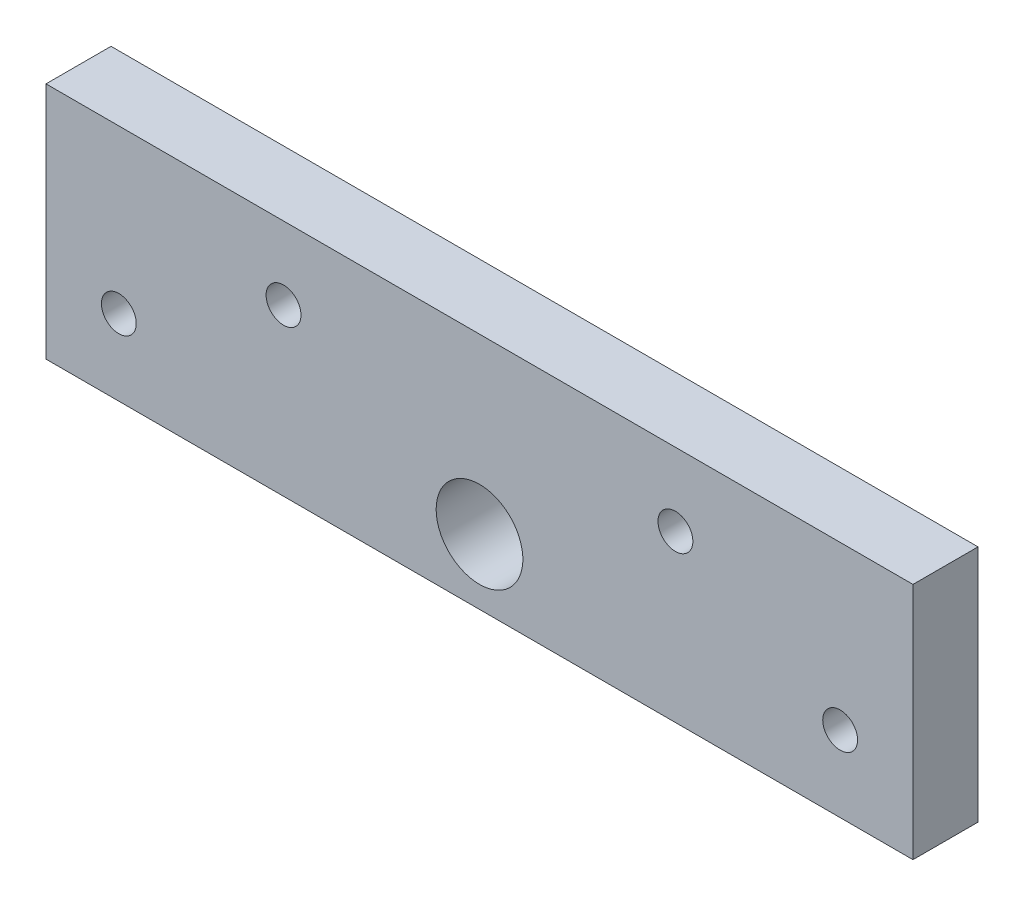
ISO-10303-21;
HEADER;
FILE_DESCRIPTION(('STEP AP214'),'2;1');
FILE_NAME('part.step','',(''),(''),'','','');
FILE_SCHEMA(('AUTOMOTIVE_DESIGN { 1 0 10303 214 1 1 1 1 }'));
ENDSEC;
DATA;
#1=APPLICATION_CONTEXT('core data for automotive mechanical design processes');
#2=APPLICATION_PROTOCOL_DEFINITION('international standard','automotive_design',2000,#1);
#3=PRODUCT_CONTEXT('',#1,'mechanical');
#4=PRODUCT('Part','Part','',(#3));
#5=PRODUCT_RELATED_PRODUCT_CATEGORY('part','',(#4));
#6=PRODUCT_DEFINITION_FORMATION('','',#4);
#7=PRODUCT_DEFINITION_CONTEXT('part definition',#1,'design');
#8=PRODUCT_DEFINITION('design','',#6,#7);
#9=PRODUCT_DEFINITION_SHAPE('','',#8);
#10=(LENGTH_UNIT() NAMED_UNIT(*) SI_UNIT(.MILLI.,.METRE.));
#11=(NAMED_UNIT(*) PLANE_ANGLE_UNIT() SI_UNIT($,.RADIAN.));
#12=(NAMED_UNIT(*) SI_UNIT($,.STERADIAN.) SOLID_ANGLE_UNIT());
#13=UNCERTAINTY_MEASURE_WITH_UNIT(LENGTH_MEASURE(1.E-05),#10,'distance_accuracy_value','');
#14=(GEOMETRIC_REPRESENTATION_CONTEXT(3) GLOBAL_UNCERTAINTY_ASSIGNED_CONTEXT((#13)) GLOBAL_UNIT_ASSIGNED_CONTEXT((#10,
#11,#12)) REPRESENTATION_CONTEXT('',''));
#15=CARTESIAN_POINT('',(0.,0.,0.));
#16=DIRECTION('',(0.,0.,1.));
#17=DIRECTION('',(1.,0.,0.));
#18=AXIS2_PLACEMENT_3D('',#15,#16,#17);
#19=CARTESIAN_POINT('',(0.,0.,0.));
#20=DIRECTION('',(0.,0.,1.));
#21=DIRECTION('',(1.,0.,0.));
#22=AXIS2_PLACEMENT_3D('',#19,#20,#21);
#23=PLANE('',#22);
#24=CARTESIAN_POINT('',(0.,6.34999999999999,0.));
#25=DIRECTION('',(0.,0.,1.));
#26=DIRECTION('',(1.,0.,0.));
#27=AXIS2_PLACEMENT_3D('',#24,#25,#26);
#28=CIRCLE('',#27,6.35);
#29=CARTESIAN_POINT('',(-6.35000000000002,6.34999999999999,0.));
#30=VERTEX_POINT('',#29);
#31=EDGE_CURVE('E114',#30,#30,#28,.T.);
#32=ORIENTED_EDGE('',*,*,#31,.T.);
#33=EDGE_LOOP('',(#32));
#34=FACE_BOUND('',#33,.T.);
#35=DIRECTION('',(0.,-1.,0.));
#36=VECTOR('',#35,1.);
#37=CARTESIAN_POINT('',(-63.5,31.75,0.));
#38=LINE('',#37,#36);
#39=CARTESIAN_POINT('',(-63.5,31.75,0.));
#40=VERTEX_POINT('',#39);
#41=CARTESIAN_POINT('',(-63.5,-3.17500000000001,0.));
#42=VERTEX_POINT('',#41);
#43=EDGE_CURVE('E100',#40,#42,#38,.T.);
#44=ORIENTED_EDGE('',*,*,#43,.F.);
#45=DIRECTION('',(-1.,0.,0.));
#46=VECTOR('',#45,1.);
#47=CARTESIAN_POINT('',(-63.5,31.75,0.));
#48=LINE('',#47,#46);
#49=CARTESIAN_POINT('',(63.5,31.75,0.));
#50=VERTEX_POINT('',#49);
#51=EDGE_CURVE('E75',#50,#40,#48,.T.);
#52=ORIENTED_EDGE('',*,*,#51,.F.);
#53=DIRECTION('',(0.,1.,0.));
#54=VECTOR('',#53,1.);
#55=CARTESIAN_POINT('',(63.5,31.75,0.));
#56=LINE('',#55,#54);
#57=CARTESIAN_POINT('',(63.5,-3.17500000000001,0.));
#58=VERTEX_POINT('',#57);
#59=EDGE_CURVE('E69',#58,#50,#56,.T.);
#60=ORIENTED_EDGE('',*,*,#59,.F.);
#61=DIRECTION('',(1.,0.,0.));
#62=VECTOR('',#61,1.);
#63=CARTESIAN_POINT('',(-63.5,-3.17500000000001,0.));
#64=LINE('',#63,#62);
#65=EDGE_CURVE('E92',#42,#58,#64,.T.);
#66=ORIENTED_EDGE('',*,*,#65,.F.);
#67=EDGE_LOOP('',(#44,#52,#60,#66));
#68=FACE_BOUND('',#67,.T.);
#69=CARTESIAN_POINT('',(-52.832,7.93749999999999,0.));
#70=DIRECTION('',(0.,0.,-1.));
#71=DIRECTION('',(-1.,0.,0.));
#72=AXIS2_PLACEMENT_3D('',#69,#70,#71);
#73=CIRCLE('',#72,5.3975);
#74=CARTESIAN_POINT('',(-58.2295,7.93749999999999,0.));
#75=VERTEX_POINT('',#74);
#76=EDGE_CURVE('E131',#75,#75,#73,.T.);
#77=ORIENTED_EDGE('',*,*,#76,.F.);
#78=EDGE_LOOP('',(#77));
#79=FACE_BOUND('',#78,.T.);
#80=CARTESIAN_POINT('',(-28.702,21.082,0.));
#81=DIRECTION('',(0.,0.,-1.));
#82=DIRECTION('',(-1.,0.,0.));
#83=AXIS2_PLACEMENT_3D('',#80,#81,#82);
#84=CIRCLE('',#83,5.3975);
#85=CARTESIAN_POINT('',(-34.0995,21.082,0.));
#86=VERTEX_POINT('',#85);
#87=EDGE_CURVE('E146',#86,#86,#84,.T.);
#88=ORIENTED_EDGE('',*,*,#87,.F.);
#89=EDGE_LOOP('',(#88));
#90=FACE_BOUND('',#89,.T.);
#91=CARTESIAN_POINT('',(52.832,7.93749999999999,0.));
#92=DIRECTION('',(0.,0.,-1.));
#93=DIRECTION('',(-1.,0.,0.));
#94=AXIS2_PLACEMENT_3D('',#91,#92,#93);
#95=CIRCLE('',#94,5.3975);
#96=CARTESIAN_POINT('',(47.4345,7.93749999999999,0.));
#97=VERTEX_POINT('',#96);
#98=EDGE_CURVE('E161',#97,#97,#95,.T.);
#99=ORIENTED_EDGE('',*,*,#98,.F.);
#100=EDGE_LOOP('',(#99));
#101=FACE_BOUND('',#100,.T.);
#102=CARTESIAN_POINT('',(28.702,21.082,0.));
#103=DIRECTION('',(0.,0.,-1.));
#104=DIRECTION('',(-1.,0.,0.));
#105=AXIS2_PLACEMENT_3D('',#102,#103,#104);
#106=CIRCLE('',#105,5.3975);
#107=CARTESIAN_POINT('',(23.3045,21.082,0.));
#108=VERTEX_POINT('',#107);
#109=EDGE_CURVE('E176',#108,#108,#106,.T.);
#110=ORIENTED_EDGE('',*,*,#109,.F.);
#111=EDGE_LOOP('',(#110));
#112=FACE_BOUND('',#111,.T.);
#113=ADVANCED_FACE('F35',(#34,#68,#79,#90,#101,#112),#23,.F.);
#114=CARTESIAN_POINT('',(0.,0.,9.525));
#115=DIRECTION('',(0.,0.,1.));
#116=DIRECTION('',(1.,0.,0.));
#117=AXIS2_PLACEMENT_3D('',#114,#115,#116);
#118=PLANE('',#117);
#119=CARTESIAN_POINT('',(28.702,21.082,9.525));
#120=DIRECTION('',(0.,0.,1.));
#121=DIRECTION('',(1.,0.,0.));
#122=AXIS2_PLACEMENT_3D('',#119,#120,#121);
#123=CIRCLE('',#122,2.5527);
#124=CARTESIAN_POINT('',(31.2547,21.082,9.525));
#125=VERTEX_POINT('',#124);
#126=EDGE_CURVE('E164',#125,#125,#123,.T.);
#127=ORIENTED_EDGE('',*,*,#126,.F.);
#128=EDGE_LOOP('',(#127));
#129=FACE_BOUND('',#128,.T.);
#130=CARTESIAN_POINT('',(52.832,7.93749999999999,9.525));
#131=DIRECTION('',(0.,0.,1.));
#132=DIRECTION('',(1.,0.,0.));
#133=AXIS2_PLACEMENT_3D('',#130,#131,#132);
#134=CIRCLE('',#133,2.5527);
#135=CARTESIAN_POINT('',(55.3847,7.93749999999999,9.525));
#136=VERTEX_POINT('',#135);
#137=EDGE_CURVE('E149',#136,#136,#134,.T.);
#138=ORIENTED_EDGE('',*,*,#137,.F.);
#139=EDGE_LOOP('',(#138));
#140=FACE_BOUND('',#139,.T.);
#141=CARTESIAN_POINT('',(-28.702,21.082,9.525));
#142=DIRECTION('',(0.,0.,1.));
#143=DIRECTION('',(1.,0.,0.));
#144=AXIS2_PLACEMENT_3D('',#141,#142,#143);
#145=CIRCLE('',#144,2.5527);
#146=CARTESIAN_POINT('',(-26.1493,21.082,9.525));
#147=VERTEX_POINT('',#146);
#148=EDGE_CURVE('E134',#147,#147,#145,.T.);
#149=ORIENTED_EDGE('',*,*,#148,.F.);
#150=EDGE_LOOP('',(#149));
#151=FACE_BOUND('',#150,.T.);
#152=CARTESIAN_POINT('',(-52.832,7.93749999999999,9.525));
#153=DIRECTION('',(0.,0.,1.));
#154=DIRECTION('',(1.,0.,0.));
#155=AXIS2_PLACEMENT_3D('',#152,#153,#154);
#156=CIRCLE('',#155,2.5527);
#157=CARTESIAN_POINT('',(-50.2793,7.93749999999999,9.525));
#158=VERTEX_POINT('',#157);
#159=EDGE_CURVE('E117',#158,#158,#156,.T.);
#160=ORIENTED_EDGE('',*,*,#159,.F.);
#161=EDGE_LOOP('',(#160));
#162=FACE_BOUND('',#161,.T.);
#163=DIRECTION('',(0.,-1.,0.));
#164=VECTOR('',#163,1.);
#165=CARTESIAN_POINT('',(-63.5,31.75,9.525));
#166=LINE('',#165,#164);
#167=CARTESIAN_POINT('',(-63.5,31.75,9.525));
#168=VERTEX_POINT('',#167);
#169=CARTESIAN_POINT('',(-63.5,-3.17500000000001,9.525));
#170=VERTEX_POINT('',#169);
#171=EDGE_CURVE('E88',#168,#170,#166,.T.);
#172=ORIENTED_EDGE('',*,*,#171,.T.);
#173=DIRECTION('',(1.,0.,0.));
#174=VECTOR('',#173,1.);
#175=CARTESIAN_POINT('',(-63.5,-3.17500000000001,9.525));
#176=LINE('',#175,#174);
#177=CARTESIAN_POINT('',(63.5,-3.17500000000001,9.525));
#178=VERTEX_POINT('',#177);
#179=EDGE_CURVE('E82',#170,#178,#176,.T.);
#180=ORIENTED_EDGE('',*,*,#179,.T.);
#181=DIRECTION('',(0.,1.,0.));
#182=VECTOR('',#181,1.);
#183=CARTESIAN_POINT('',(63.5,31.75,9.525));
#184=LINE('',#183,#182);
#185=CARTESIAN_POINT('',(63.5,31.75,9.525));
#186=VERTEX_POINT('',#185);
#187=EDGE_CURVE('E86',#178,#186,#184,.T.);
#188=ORIENTED_EDGE('',*,*,#187,.T.);
#189=DIRECTION('',(-1.,0.,0.));
#190=VECTOR('',#189,1.);
#191=CARTESIAN_POINT('',(-63.5,31.75,9.525));
#192=LINE('',#191,#190);
#193=EDGE_CURVE('E52',#186,#168,#192,.T.);
#194=ORIENTED_EDGE('',*,*,#193,.T.);
#195=EDGE_LOOP('',(#172,#180,#188,#194));
#196=FACE_BOUND('',#195,.T.);
#197=CARTESIAN_POINT('',(0.,6.34999999999999,9.525));
#198=DIRECTION('',(0.,0.,1.));
#199=DIRECTION('',(1.,0.,0.));
#200=AXIS2_PLACEMENT_3D('',#197,#198,#199);
#201=CIRCLE('',#200,6.35);
#202=CARTESIAN_POINT('',(-6.35000000000002,6.34999999999999,9.525));
#203=VERTEX_POINT('',#202);
#204=EDGE_CURVE('E103',#203,#203,#201,.T.);
#205=ORIENTED_EDGE('',*,*,#204,.F.);
#206=EDGE_LOOP('',(#205));
#207=FACE_BOUND('',#206,.T.);
#208=ADVANCED_FACE('F83',(#129,#140,#151,#162,#196,#207),#118,.T.);
#209=CARTESIAN_POINT('',(-63.5,31.75,9.525));
#210=DIRECTION('',(1.,0.,0.));
#211=DIRECTION('',(0.,0.,-1.));
#212=AXIS2_PLACEMENT_3D('',#209,#210,#211);
#213=PLANE('',#212);
#214=ORIENTED_EDGE('',*,*,#43,.T.);
#215=DIRECTION('',(0.,0.,-1.));
#216=VECTOR('',#215,1.);
#217=CARTESIAN_POINT('',(-63.5,-3.17500000000001,9.525));
#218=LINE('',#217,#216);
#219=EDGE_CURVE('E11',#170,#42,#218,.T.);
#220=ORIENTED_EDGE('',*,*,#219,.F.);
#221=ORIENTED_EDGE('',*,*,#171,.F.);
#222=DIRECTION('',(0.,0.,-1.));
#223=VECTOR('',#222,1.);
#224=CARTESIAN_POINT('',(-63.5,31.75,9.525));
#225=LINE('',#224,#223);
#226=EDGE_CURVE('E96',#168,#40,#225,.T.);
#227=ORIENTED_EDGE('',*,*,#226,.T.);
#228=EDGE_LOOP('',(#214,#220,#221,#227));
#229=FACE_BOUND('',#228,.T.);
#230=ADVANCED_FACE('F37',(#229),#213,.F.);
#231=CARTESIAN_POINT('',(-63.5,-3.17500000000001,9.525));
#232=DIRECTION('',(0.,1.,0.));
#233=DIRECTION('',(0.,0.,1.));
#234=AXIS2_PLACEMENT_3D('',#231,#232,#233);
#235=PLANE('',#234);
#236=ORIENTED_EDGE('',*,*,#65,.T.);
#237=DIRECTION('',(0.,0.,-1.));
#238=VECTOR('',#237,1.);
#239=CARTESIAN_POINT('',(63.5,-3.17500000000001,9.525));
#240=LINE('',#239,#238);
#241=EDGE_CURVE('E44',#178,#58,#240,.T.);
#242=ORIENTED_EDGE('',*,*,#241,.F.);
#243=ORIENTED_EDGE('',*,*,#179,.F.);
#244=ORIENTED_EDGE('',*,*,#219,.T.);
#245=EDGE_LOOP('',(#236,#242,#243,#244));
#246=FACE_BOUND('',#245,.T.);
#247=ADVANCED_FACE('F91',(#246),#235,.F.);
#248=CARTESIAN_POINT('',(63.5,31.75,9.525));
#249=DIRECTION('',(-1.,0.,0.));
#250=DIRECTION('',(0.,-1.,0.));
#251=AXIS2_PLACEMENT_3D('',#248,#249,#250);
#252=PLANE('',#251);
#253=ORIENTED_EDGE('',*,*,#59,.T.);
#254=DIRECTION('',(0.,0.,-1.));
#255=VECTOR('',#254,1.);
#256=CARTESIAN_POINT('',(63.5,31.75,9.525));
#257=LINE('',#256,#255);
#258=EDGE_CURVE('E93',#186,#50,#257,.T.);
#259=ORIENTED_EDGE('',*,*,#258,.F.);
#260=ORIENTED_EDGE('',*,*,#187,.F.);
#261=ORIENTED_EDGE('',*,*,#241,.T.);
#262=EDGE_LOOP('',(#253,#259,#260,#261));
#263=FACE_BOUND('',#262,.T.);
#264=ADVANCED_FACE('F94',(#263),#252,.F.);
#265=CARTESIAN_POINT('',(-63.5,31.75,9.525));
#266=DIRECTION('',(0.,-1.,0.));
#267=DIRECTION('',(0.,0.,-1.));
#268=AXIS2_PLACEMENT_3D('',#265,#266,#267);
#269=PLANE('',#268);
#270=ORIENTED_EDGE('',*,*,#51,.T.);
#271=ORIENTED_EDGE('',*,*,#226,.F.);
#272=ORIENTED_EDGE('',*,*,#193,.F.);
#273=ORIENTED_EDGE('',*,*,#258,.T.);
#274=EDGE_LOOP('',(#270,#271,#272,#273));
#275=FACE_BOUND('',#274,.T.);
#276=ADVANCED_FACE('F108',(#275),#269,.F.);
#277=CARTESIAN_POINT('',(0.,6.34999999999999,9.525));
#278=DIRECTION('',(0.,0.,-1.));
#279=DIRECTION('',(-1.,0.,0.));
#280=AXIS2_PLACEMENT_3D('',#277,#278,#279);
#281=CYLINDRICAL_SURFACE('',#280,6.35);
#282=CARTESIAN_POINT('',(-6.35000000000002,6.34999999999999,9.525));
#283=CARTESIAN_POINT('',(-6.35000000000002,6.34999999999999,9.42578125));
#284=CARTESIAN_POINT('',(-6.35000000000002,6.34999999999999,9.3265625));
#285=CARTESIAN_POINT('',(-6.35000000000002,6.34999999999999,9.128125));
#286=CARTESIAN_POINT('',(-6.35000000000002,6.34999999999999,9.02890625));
#287=CARTESIAN_POINT('',(-6.35000000000002,6.34999999999999,8.83046875));
#288=CARTESIAN_POINT('',(-6.35000000000002,6.34999999999999,8.73125));
#289=CARTESIAN_POINT('',(-6.35000000000002,6.34999999999999,8.5328125));
#290=CARTESIAN_POINT('',(-6.35000000000002,6.34999999999999,8.43359375));
#291=CARTESIAN_POINT('',(-6.35000000000002,6.34999999999999,8.23515625));
#292=CARTESIAN_POINT('',(-6.35000000000002,6.34999999999999,8.1359375));
#293=CARTESIAN_POINT('',(-6.35000000000002,6.34999999999999,7.9375));
#294=CARTESIAN_POINT('',(-6.35000000000002,6.34999999999999,7.83828125));
#295=CARTESIAN_POINT('',(-6.35000000000002,6.34999999999999,7.63984375));
#296=CARTESIAN_POINT('',(-6.35000000000002,6.34999999999999,7.540625));
#297=CARTESIAN_POINT('',(-6.35000000000002,6.34999999999999,7.3421875));
#298=CARTESIAN_POINT('',(-6.35000000000002,6.34999999999999,7.24296875));
#299=CARTESIAN_POINT('',(-6.35000000000002,6.34999999999999,7.04453125));
#300=CARTESIAN_POINT('',(-6.35000000000002,6.34999999999999,6.9453125));
#301=CARTESIAN_POINT('',(-6.35000000000002,6.34999999999999,6.746875));
#302=CARTESIAN_POINT('',(-6.35000000000002,6.34999999999999,6.64765625));
#303=CARTESIAN_POINT('',(-6.35000000000002,6.34999999999999,6.44921875));
#304=CARTESIAN_POINT('',(-6.35000000000002,6.34999999999999,6.35));
#305=CARTESIAN_POINT('',(-6.35000000000002,6.34999999999999,6.1515625));
#306=CARTESIAN_POINT('',(-6.35000000000002,6.34999999999999,6.05234375));
#307=CARTESIAN_POINT('',(-6.35000000000002,6.34999999999999,5.85390625));
#308=CARTESIAN_POINT('',(-6.35000000000002,6.34999999999999,5.7546875));
#309=CARTESIAN_POINT('',(-6.35000000000002,6.34999999999999,5.55625));
#310=CARTESIAN_POINT('',(-6.35000000000002,6.34999999999999,5.45703125));
#311=CARTESIAN_POINT('',(-6.35000000000002,6.34999999999999,5.25859375));
#312=CARTESIAN_POINT('',(-6.35000000000002,6.34999999999999,5.159375));
#313=CARTESIAN_POINT('',(-6.35000000000002,6.34999999999999,4.9609375));
#314=CARTESIAN_POINT('',(-6.35000000000002,6.34999999999999,4.86171875));
#315=CARTESIAN_POINT('',(-6.35000000000002,6.34999999999999,4.66328125));
#316=CARTESIAN_POINT('',(-6.35000000000002,6.34999999999999,4.5640625));
#317=CARTESIAN_POINT('',(-6.35000000000002,6.34999999999999,4.365625));
#318=CARTESIAN_POINT('',(-6.35000000000002,6.34999999999999,4.26640625));
#319=CARTESIAN_POINT('',(-6.35000000000002,6.34999999999999,4.06796875));
#320=CARTESIAN_POINT('',(-6.35000000000002,6.34999999999999,3.96875));
#321=CARTESIAN_POINT('',(-6.35000000000002,6.34999999999999,3.7703125));
#322=CARTESIAN_POINT('',(-6.35000000000002,6.34999999999999,3.67109375));
#323=CARTESIAN_POINT('',(-6.35000000000002,6.34999999999999,3.47265625));
#324=CARTESIAN_POINT('',(-6.35000000000002,6.34999999999999,3.3734375));
#325=CARTESIAN_POINT('',(-6.35000000000002,6.34999999999999,3.175));
#326=CARTESIAN_POINT('',(-6.35000000000002,6.34999999999999,3.07578125));
#327=CARTESIAN_POINT('',(-6.35000000000002,6.34999999999999,2.87734375));
#328=CARTESIAN_POINT('',(-6.35000000000002,6.34999999999999,2.778125));
#329=CARTESIAN_POINT('',(-6.35000000000002,6.34999999999999,2.5796875));
#330=CARTESIAN_POINT('',(-6.35000000000002,6.34999999999999,2.48046875));
#331=CARTESIAN_POINT('',(-6.35000000000002,6.34999999999999,2.28203125));
#332=CARTESIAN_POINT('',(-6.35000000000002,6.34999999999999,2.1828125));
#333=CARTESIAN_POINT('',(-6.35000000000002,6.34999999999999,1.984375));
#334=CARTESIAN_POINT('',(-6.35000000000002,6.34999999999999,1.88515625));
#335=CARTESIAN_POINT('',(-6.35000000000002,6.34999999999999,1.68671875));
#336=CARTESIAN_POINT('',(-6.35000000000002,6.34999999999999,1.5875));
#337=CARTESIAN_POINT('',(-6.35000000000002,6.34999999999999,1.3890625));
#338=CARTESIAN_POINT('',(-6.35000000000002,6.34999999999999,1.28984375));
#339=CARTESIAN_POINT('',(-6.35000000000002,6.34999999999999,1.09140625));
#340=CARTESIAN_POINT('',(-6.35000000000002,6.34999999999999,0.992187500000001));
#341=CARTESIAN_POINT('',(-6.35000000000002,6.34999999999999,0.793750000000001));
#342=CARTESIAN_POINT('',(-6.35000000000002,6.34999999999999,0.69453125));
#343=CARTESIAN_POINT('',(-6.35000000000002,6.34999999999999,0.49609375));
#344=CARTESIAN_POINT('',(-6.35000000000002,6.34999999999999,0.396875));
#345=CARTESIAN_POINT('',(-6.35000000000002,6.34999999999999,0.1984375));
#346=CARTESIAN_POINT('',(-6.35000000000002,6.34999999999999,0.0992187500000001));
#347=CARTESIAN_POINT('',(-6.35000000000002,6.34999999999999,0.));
#348=B_SPLINE_CURVE_WITH_KNOTS('',3,(#282,#283,#284,#285,#286,#287,#288,#289,#290,#291,#292,
#293,#294,#295,#296,#297,#298,#299,#300,#301,#302,#303,#304,#305,#306,#307,#308,#309,#310,#311,
#312,#313,#314,#315,#316,#317,#318,#319,#320,#321,#322,#323,#324,#325,#326,#327,#328,#329,#330,
#331,#332,#333,#334,#335,#336,#337,#338,#339,#340,#341,#342,#343,#344,#345,#346,#347),
.UNSPECIFIED.,.F.,.F.,(4,2,2,2,2,2,2,2,2,2,2,2,2,2,2,2,2,2,2,2,2,2,2,2,2,2,2,2,2,2,2,2,4),(0.,
0.297656249999998,0.595312499999999,0.892968749999999,1.190625,1.48828125,1.7859375,2.08359375,
2.38125,2.67890625,2.9765625,3.27421875,3.571875,3.86953125,4.1671875,4.46484375,4.7625,
5.06015625,5.3578125,5.65546875,5.953125,6.25078125,6.5484375,6.84609375,7.14375,7.44140625,
7.7390625,8.03671875,8.334375,8.63203125,8.9296875,9.22734375,9.525),.UNSPECIFIED.);
#349=EDGE_CURVE('BSEAM194',#203,#30,#348,.T.);
#350=ORIENTED_EDGE('',*,*,#204,.T.);
#351=ORIENTED_EDGE('',*,*,#31,.F.);
#352=ORIENTED_EDGE('',*,*,#349,.T.);
#353=ORIENTED_EDGE('',*,*,#349,.F.);
#354=EDGE_LOOP('',(#350,#352,#351,#353));
#355=FACE_BOUND('',#354,.T.);
#356=ADVANCED_FACE('F194',(#355),#281,.F.);
#357=CARTESIAN_POINT('',(-52.832,7.93749999999999,0.));
#358=DIRECTION('',(0.,0.,-1.));
#359=DIRECTION('',(-1.,0.,0.));
#360=AXIS2_PLACEMENT_3D('',#357,#358,#359);
#361=CYLINDRICAL_SURFACE('',#360,2.5527);
#362=CARTESIAN_POINT('',(-52.832,7.93749999999999,4.826));
#363=DIRECTION('',(0.,0.,-1.));
#364=DIRECTION('',(-1.,0.,0.));
#365=AXIS2_PLACEMENT_3D('',#362,#363,#364);
#366=CIRCLE('',#365,2.5527);
#367=CARTESIAN_POINT('',(-55.3847,7.93749999999999,4.826));
#368=VERTEX_POINT('',#367);
#369=EDGE_CURVE('E122',#368,#368,#366,.T.);
#370=ORIENTED_EDGE('',*,*,#369,.T.);
#371=EDGE_LOOP('',(#370));
#372=FACE_BOUND('',#371,.T.);
#373=ORIENTED_EDGE('',*,*,#159,.T.);
#374=EDGE_LOOP('',(#373));
#375=FACE_BOUND('',#374,.T.);
#376=ADVANCED_FACE('F214',(#372,#375),#361,.F.);
#377=CARTESIAN_POINT('',(-48.0695,7.93749999999999,4.826));
#378=DIRECTION('',(0.,0.,1.));
#379=DIRECTION('',(1.,0.,0.));
#380=AXIS2_PLACEMENT_3D('',#377,#378,#379);
#381=PLANE('',#380);
#382=ORIENTED_EDGE('',*,*,#369,.F.);
#383=EDGE_LOOP('',(#382));
#384=FACE_BOUND('',#383,.T.);
#385=CARTESIAN_POINT('',(-52.832,7.93749999999999,4.826));
#386=DIRECTION('',(0.,0.,-1.));
#387=DIRECTION('',(-1.,0.,0.));
#388=AXIS2_PLACEMENT_3D('',#385,#386,#387);
#389=CIRCLE('',#388,4.7625);
#390=CARTESIAN_POINT('',(-57.5945,7.93749999999999,4.826));
#391=VERTEX_POINT('',#390);
#392=EDGE_CURVE('E125',#391,#391,#389,.T.);
#393=ORIENTED_EDGE('',*,*,#392,.T.);
#394=EDGE_LOOP('',(#393));
#395=FACE_BOUND('',#394,.T.);
#396=ADVANCED_FACE('F219',(#384,#395),#381,.F.);
#397=CARTESIAN_POINT('',(-52.832,7.93749999999999,0.));
#398=DIRECTION('',(0.,0.,-1.));
#399=DIRECTION('',(-1.,0.,0.));
#400=AXIS2_PLACEMENT_3D('',#397,#398,#399);
#401=CYLINDRICAL_SURFACE('',#400,4.7625);
#402=ORIENTED_EDGE('',*,*,#392,.F.);
#403=EDGE_LOOP('',(#402));
#404=FACE_BOUND('',#403,.T.);
#405=CARTESIAN_POINT('',(-52.832,7.93749999999999,0.635));
#406=DIRECTION('',(0.,0.,-1.));
#407=DIRECTION('',(-1.,0.,0.));
#408=AXIS2_PLACEMENT_3D('',#405,#406,#407);
#409=CIRCLE('',#408,4.7625);
#410=CARTESIAN_POINT('',(-57.5945,7.93749999999999,0.635));
#411=VERTEX_POINT('',#410);
#412=EDGE_CURVE('E128',#411,#411,#409,.T.);
#413=ORIENTED_EDGE('',*,*,#412,.T.);
#414=EDGE_LOOP('',(#413));
#415=FACE_BOUND('',#414,.T.);
#416=ADVANCED_FACE('F230',(#404,#415),#401,.F.);
#417=CARTESIAN_POINT('',(-52.832,7.93749999999999,0.));
#418=DIRECTION('',(0.,0.,-1.));
#419=DIRECTION('',(-1.,0.,0.));
#420=AXIS2_PLACEMENT_3D('',#417,#418,#419);
#421=CONICAL_SURFACE('',#420,5.3975,0.785398163397451);
#422=ORIENTED_EDGE('',*,*,#412,.F.);
#423=EDGE_LOOP('',(#422));
#424=FACE_BOUND('',#423,.T.);
#425=ORIENTED_EDGE('',*,*,#76,.T.);
#426=EDGE_LOOP('',(#425));
#427=FACE_BOUND('',#426,.T.);
#428=ADVANCED_FACE('F240',(#424,#427),#421,.F.);
#429=CARTESIAN_POINT('',(-28.702,21.082,0.));
#430=DIRECTION('',(0.,0.,-1.));
#431=DIRECTION('',(-1.,0.,0.));
#432=AXIS2_PLACEMENT_3D('',#429,#430,#431);
#433=CYLINDRICAL_SURFACE('',#432,2.5527);
#434=CARTESIAN_POINT('',(-28.702,21.082,4.826));
#435=DIRECTION('',(0.,0.,-1.));
#436=DIRECTION('',(-1.,0.,0.));
#437=AXIS2_PLACEMENT_3D('',#434,#435,#436);
#438=CIRCLE('',#437,2.5527);
#439=CARTESIAN_POINT('',(-31.2547,21.082,4.826));
#440=VERTEX_POINT('',#439);
#441=EDGE_CURVE('E137',#440,#440,#438,.T.);
#442=ORIENTED_EDGE('',*,*,#441,.T.);
#443=EDGE_LOOP('',(#442));
#444=FACE_BOUND('',#443,.T.);
#445=ORIENTED_EDGE('',*,*,#148,.T.);
#446=EDGE_LOOP('',(#445));
#447=FACE_BOUND('',#446,.T.);
#448=ADVANCED_FACE('F250',(#444,#447),#433,.F.);
#449=CARTESIAN_POINT('',(-23.9395,21.082,4.826));
#450=DIRECTION('',(0.,0.,1.));
#451=DIRECTION('',(1.,0.,0.));
#452=AXIS2_PLACEMENT_3D('',#449,#450,#451);
#453=PLANE('',#452);
#454=ORIENTED_EDGE('',*,*,#441,.F.);
#455=EDGE_LOOP('',(#454));
#456=FACE_BOUND('',#455,.T.);
#457=CARTESIAN_POINT('',(-28.702,21.082,4.826));
#458=DIRECTION('',(0.,0.,-1.));
#459=DIRECTION('',(-1.,0.,0.));
#460=AXIS2_PLACEMENT_3D('',#457,#458,#459);
#461=CIRCLE('',#460,4.7625);
#462=CARTESIAN_POINT('',(-33.4645,21.082,4.826));
#463=VERTEX_POINT('',#462);
#464=EDGE_CURVE('E140',#463,#463,#461,.T.);
#465=ORIENTED_EDGE('',*,*,#464,.T.);
#466=EDGE_LOOP('',(#465));
#467=FACE_BOUND('',#466,.T.);
#468=ADVANCED_FACE('F260',(#456,#467),#453,.F.);
#469=CARTESIAN_POINT('',(-28.702,21.082,0.));
#470=DIRECTION('',(0.,0.,-1.));
#471=DIRECTION('',(-1.,0.,0.));
#472=AXIS2_PLACEMENT_3D('',#469,#470,#471);
#473=CYLINDRICAL_SURFACE('',#472,4.7625);
#474=ORIENTED_EDGE('',*,*,#464,.F.);
#475=EDGE_LOOP('',(#474));
#476=FACE_BOUND('',#475,.T.);
#477=CARTESIAN_POINT('',(-28.702,21.082,0.635));
#478=DIRECTION('',(0.,0.,-1.));
#479=DIRECTION('',(-1.,0.,0.));
#480=AXIS2_PLACEMENT_3D('',#477,#478,#479);
#481=CIRCLE('',#480,4.7625);
#482=CARTESIAN_POINT('',(-33.4645,21.082,0.635));
#483=VERTEX_POINT('',#482);
#484=EDGE_CURVE('E143',#483,#483,#481,.T.);
#485=ORIENTED_EDGE('',*,*,#484,.T.);
#486=EDGE_LOOP('',(#485));
#487=FACE_BOUND('',#486,.T.);
#488=ADVANCED_FACE('F270',(#476,#487),#473,.F.);
#489=CARTESIAN_POINT('',(-28.702,21.082,0.));
#490=DIRECTION('',(0.,0.,-1.));
#491=DIRECTION('',(-1.,0.,0.));
#492=AXIS2_PLACEMENT_3D('',#489,#490,#491);
#493=CONICAL_SURFACE('',#492,5.3975,0.785398163397449);
#494=ORIENTED_EDGE('',*,*,#484,.F.);
#495=EDGE_LOOP('',(#494));
#496=FACE_BOUND('',#495,.T.);
#497=ORIENTED_EDGE('',*,*,#87,.T.);
#498=EDGE_LOOP('',(#497));
#499=FACE_BOUND('',#498,.T.);
#500=ADVANCED_FACE('F280',(#496,#499),#493,.F.);
#501=CARTESIAN_POINT('',(52.832,7.93749999999999,0.));
#502=DIRECTION('',(0.,0.,-1.));
#503=DIRECTION('',(-1.,0.,0.));
#504=AXIS2_PLACEMENT_3D('',#501,#502,#503);
#505=CYLINDRICAL_SURFACE('',#504,2.5527);
#506=CARTESIAN_POINT('',(52.832,7.93749999999999,4.826));
#507=DIRECTION('',(0.,0.,-1.));
#508=DIRECTION('',(-1.,0.,0.));
#509=AXIS2_PLACEMENT_3D('',#506,#507,#508);
#510=CIRCLE('',#509,2.5527);
#511=CARTESIAN_POINT('',(50.2793,7.93749999999999,4.826));
#512=VERTEX_POINT('',#511);
#513=EDGE_CURVE('E152',#512,#512,#510,.T.);
#514=ORIENTED_EDGE('',*,*,#513,.T.);
#515=EDGE_LOOP('',(#514));
#516=FACE_BOUND('',#515,.T.);
#517=ORIENTED_EDGE('',*,*,#137,.T.);
#518=EDGE_LOOP('',(#517));
#519=FACE_BOUND('',#518,.T.);
#520=ADVANCED_FACE('F290',(#516,#519),#505,.F.);
#521=CARTESIAN_POINT('',(57.5945,7.93749999999999,4.826));
#522=DIRECTION('',(0.,0.,1.));
#523=DIRECTION('',(1.,0.,0.));
#524=AXIS2_PLACEMENT_3D('',#521,#522,#523);
#525=PLANE('',#524);
#526=ORIENTED_EDGE('',*,*,#513,.F.);
#527=EDGE_LOOP('',(#526));
#528=FACE_BOUND('',#527,.T.);
#529=CARTESIAN_POINT('',(52.832,7.93749999999999,4.826));
#530=DIRECTION('',(0.,0.,-1.));
#531=DIRECTION('',(-1.,0.,0.));
#532=AXIS2_PLACEMENT_3D('',#529,#530,#531);
#533=CIRCLE('',#532,4.7625);
#534=CARTESIAN_POINT('',(48.0695,7.93749999999999,4.826));
#535=VERTEX_POINT('',#534);
#536=EDGE_CURVE('E155',#535,#535,#533,.T.);
#537=ORIENTED_EDGE('',*,*,#536,.T.);
#538=EDGE_LOOP('',(#537));
#539=FACE_BOUND('',#538,.T.);
#540=ADVANCED_FACE('F300',(#528,#539),#525,.F.);
#541=CARTESIAN_POINT('',(52.832,7.93749999999999,0.));
#542=DIRECTION('',(0.,0.,-1.));
#543=DIRECTION('',(-1.,0.,0.));
#544=AXIS2_PLACEMENT_3D('',#541,#542,#543);
#545=CYLINDRICAL_SURFACE('',#544,4.7625);
#546=ORIENTED_EDGE('',*,*,#536,.F.);
#547=EDGE_LOOP('',(#546));
#548=FACE_BOUND('',#547,.T.);
#549=CARTESIAN_POINT('',(52.832,7.93749999999999,0.635));
#550=DIRECTION('',(0.,0.,-1.));
#551=DIRECTION('',(-1.,0.,0.));
#552=AXIS2_PLACEMENT_3D('',#549,#550,#551);
#553=CIRCLE('',#552,4.7625);
#554=CARTESIAN_POINT('',(48.0695,7.93749999999999,0.635));
#555=VERTEX_POINT('',#554);
#556=EDGE_CURVE('E158',#555,#555,#553,.T.);
#557=ORIENTED_EDGE('',*,*,#556,.T.);
#558=EDGE_LOOP('',(#557));
#559=FACE_BOUND('',#558,.T.);
#560=ADVANCED_FACE('F310',(#548,#559),#545,.F.);
#561=CARTESIAN_POINT('',(52.832,7.93749999999999,0.));
#562=DIRECTION('',(0.,0.,-1.));
#563=DIRECTION('',(-1.,0.,0.));
#564=AXIS2_PLACEMENT_3D('',#561,#562,#563);
#565=CONICAL_SURFACE('',#564,5.3975,0.785398163397451);
#566=ORIENTED_EDGE('',*,*,#556,.F.);
#567=EDGE_LOOP('',(#566));
#568=FACE_BOUND('',#567,.T.);
#569=ORIENTED_EDGE('',*,*,#98,.T.);
#570=EDGE_LOOP('',(#569));
#571=FACE_BOUND('',#570,.T.);
#572=ADVANCED_FACE('F320',(#568,#571),#565,.F.);
#573=CARTESIAN_POINT('',(28.702,21.082,0.));
#574=DIRECTION('',(0.,0.,-1.));
#575=DIRECTION('',(-1.,0.,0.));
#576=AXIS2_PLACEMENT_3D('',#573,#574,#575);
#577=CYLINDRICAL_SURFACE('',#576,2.5527);
#578=CARTESIAN_POINT('',(28.702,21.082,4.826));
#579=DIRECTION('',(0.,0.,-1.));
#580=DIRECTION('',(-1.,0.,0.));
#581=AXIS2_PLACEMENT_3D('',#578,#579,#580);
#582=CIRCLE('',#581,2.5527);
#583=CARTESIAN_POINT('',(26.1493,21.082,4.826));
#584=VERTEX_POINT('',#583);
#585=EDGE_CURVE('E167',#584,#584,#582,.T.);
#586=ORIENTED_EDGE('',*,*,#585,.T.);
#587=EDGE_LOOP('',(#586));
#588=FACE_BOUND('',#587,.T.);
#589=ORIENTED_EDGE('',*,*,#126,.T.);
#590=EDGE_LOOP('',(#589));
#591=FACE_BOUND('',#590,.T.);
#592=ADVANCED_FACE('F330',(#588,#591),#577,.F.);
#593=CARTESIAN_POINT('',(33.4645,21.082,4.826));
#594=DIRECTION('',(0.,0.,1.));
#595=DIRECTION('',(1.,0.,0.));
#596=AXIS2_PLACEMENT_3D('',#593,#594,#595);
#597=PLANE('',#596);
#598=ORIENTED_EDGE('',*,*,#585,.F.);
#599=EDGE_LOOP('',(#598));
#600=FACE_BOUND('',#599,.T.);
#601=CARTESIAN_POINT('',(28.702,21.082,4.826));
#602=DIRECTION('',(0.,0.,-1.));
#603=DIRECTION('',(-1.,0.,0.));
#604=AXIS2_PLACEMENT_3D('',#601,#602,#603);
#605=CIRCLE('',#604,4.7625);
#606=CARTESIAN_POINT('',(23.9395,21.082,4.826));
#607=VERTEX_POINT('',#606);
#608=EDGE_CURVE('E170',#607,#607,#605,.T.);
#609=ORIENTED_EDGE('',*,*,#608,.T.);
#610=EDGE_LOOP('',(#609));
#611=FACE_BOUND('',#610,.T.);
#612=ADVANCED_FACE('F340',(#600,#611),#597,.F.);
#613=CARTESIAN_POINT('',(28.702,21.082,0.));
#614=DIRECTION('',(0.,0.,-1.));
#615=DIRECTION('',(-1.,0.,0.));
#616=AXIS2_PLACEMENT_3D('',#613,#614,#615);
#617=CYLINDRICAL_SURFACE('',#616,4.7625);
#618=ORIENTED_EDGE('',*,*,#608,.F.);
#619=EDGE_LOOP('',(#618));
#620=FACE_BOUND('',#619,.T.);
#621=CARTESIAN_POINT('',(28.702,21.082,0.635));
#622=DIRECTION('',(0.,0.,-1.));
#623=DIRECTION('',(-1.,0.,0.));
#624=AXIS2_PLACEMENT_3D('',#621,#622,#623);
#625=CIRCLE('',#624,4.7625);
#626=CARTESIAN_POINT('',(23.9395,21.082,0.635));
#627=VERTEX_POINT('',#626);
#628=EDGE_CURVE('E173',#627,#627,#625,.T.);
#629=ORIENTED_EDGE('',*,*,#628,.T.);
#630=EDGE_LOOP('',(#629));
#631=FACE_BOUND('',#630,.T.);
#632=ADVANCED_FACE('F350',(#620,#631),#617,.F.);
#633=CARTESIAN_POINT('',(28.702,21.082,0.));
#634=DIRECTION('',(0.,0.,-1.));
#635=DIRECTION('',(-1.,0.,0.));
#636=AXIS2_PLACEMENT_3D('',#633,#634,#635);
#637=CONICAL_SURFACE('',#636,5.3975,0.785398163397451);
#638=ORIENTED_EDGE('',*,*,#628,.F.);
#639=EDGE_LOOP('',(#638));
#640=FACE_BOUND('',#639,.T.);
#641=ORIENTED_EDGE('',*,*,#109,.T.);
#642=EDGE_LOOP('',(#641));
#643=FACE_BOUND('',#642,.T.);
#644=ADVANCED_FACE('F180',(#640,#643),#637,.F.);
#645=CLOSED_SHELL('',(#113,#208,#230,#247,#264,#276,#356,#376,#396,#416,#428,#448,#468,#488,
#500,#520,#540,#560,#572,#592,#612,#632,#644));
#646=MANIFOLD_SOLID_BREP('B2',#645);
#647=ADVANCED_BREP_SHAPE_REPRESENTATION('',(#18,#646),#14);
#648=SHAPE_DEFINITION_REPRESENTATION(#9,#647);
ENDSEC;
END-ISO-10303-21;
